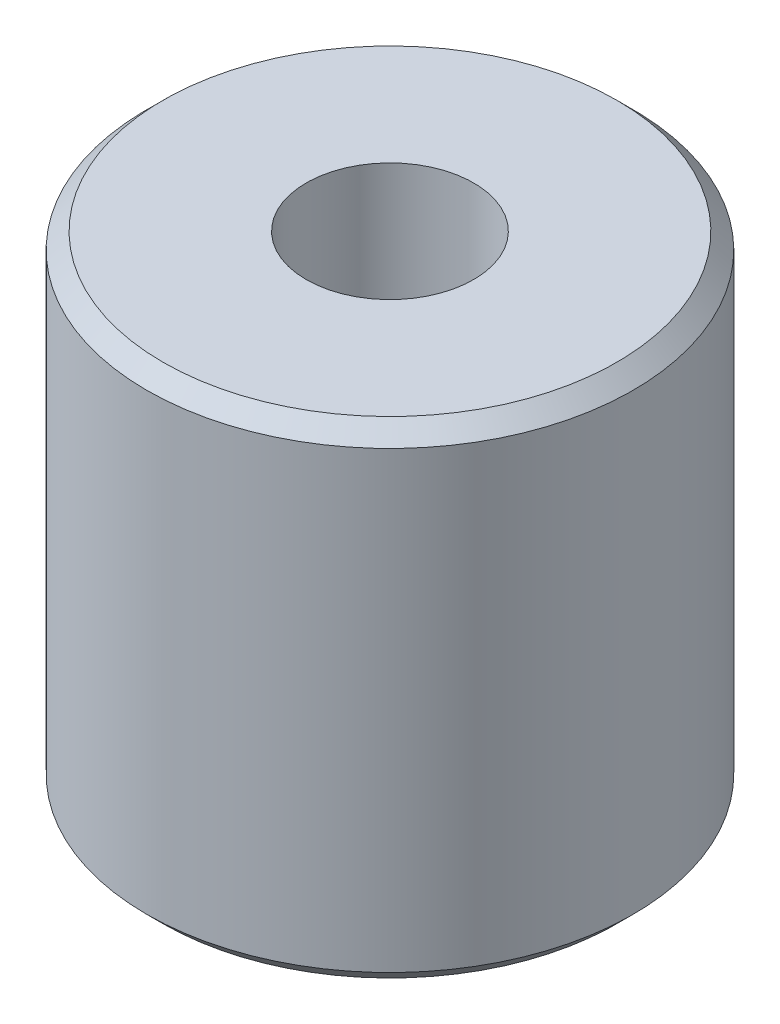
ISO-10303-21;
HEADER;
FILE_DESCRIPTION(('STEP AP214'),'2;1');
FILE_NAME('part.step','',(''),(''),'','','');
FILE_SCHEMA(('AUTOMOTIVE_DESIGN { 1 0 10303 214 1 1 1 1 }'));
ENDSEC;
DATA;
#1=APPLICATION_CONTEXT('core data for automotive mechanical design processes');
#2=APPLICATION_PROTOCOL_DEFINITION('international standard','automotive_design',2000,#1);
#3=PRODUCT_CONTEXT('',#1,'mechanical');
#4=PRODUCT('Part','Part','',(#3));
#5=PRODUCT_RELATED_PRODUCT_CATEGORY('part','',(#4));
#6=PRODUCT_DEFINITION_FORMATION('','',#4);
#7=PRODUCT_DEFINITION_CONTEXT('part definition',#1,'design');
#8=PRODUCT_DEFINITION('design','',#6,#7);
#9=PRODUCT_DEFINITION_SHAPE('','',#8);
#10=(LENGTH_UNIT() NAMED_UNIT(*) SI_UNIT(.MILLI.,.METRE.));
#11=(NAMED_UNIT(*) PLANE_ANGLE_UNIT() SI_UNIT($,.RADIAN.));
#12=(NAMED_UNIT(*) SI_UNIT($,.STERADIAN.) SOLID_ANGLE_UNIT());
#13=UNCERTAINTY_MEASURE_WITH_UNIT(LENGTH_MEASURE(1.E-05),#10,'distance_accuracy_value','');
#14=(GEOMETRIC_REPRESENTATION_CONTEXT(3) GLOBAL_UNCERTAINTY_ASSIGNED_CONTEXT((#13)) GLOBAL_UNIT_ASSIGNED_CONTEXT((#10,
#11,#12)) REPRESENTATION_CONTEXT('',''));
#15=CARTESIAN_POINT('',(0.,0.,0.));
#16=DIRECTION('',(0.,0.,1.));
#17=DIRECTION('',(1.,0.,0.));
#18=AXIS2_PLACEMENT_3D('',#15,#16,#17);
#19=CARTESIAN_POINT('',(0.,9.,0.));
#20=DIRECTION('',(0.,-1.,0.));
#21=DIRECTION('',(0.,0.,-1.));
#22=AXIS2_PLACEMENT_3D('',#19,#20,#21);
#23=CYLINDRICAL_SURFACE('',#22,4.5);
#24=CARTESIAN_POINT('',(0.,0.3,0.));
#25=DIRECTION('',(0.,1.,0.));
#26=DIRECTION('',(0.,0.,1.));
#27=AXIS2_PLACEMENT_3D('',#24,#25,#26);
#28=CIRCLE('',#27,4.5);
#29=CARTESIAN_POINT('',(0.,0.3,4.5));
#30=VERTEX_POINT('',#29);
#31=EDGE_CURVE('E37',#30,#30,#28,.T.);
#32=ORIENTED_EDGE('',*,*,#31,.T.);
#33=EDGE_LOOP('',(#32));
#34=FACE_BOUND('',#33,.T.);
#35=CARTESIAN_POINT('',(0.,8.7,0.));
#36=DIRECTION('',(0.,1.,0.));
#37=DIRECTION('',(0.,0.,1.));
#38=AXIS2_PLACEMENT_3D('',#35,#36,#37);
#39=CIRCLE('',#38,4.5);
#40=CARTESIAN_POINT('',(0.,8.7,4.5));
#41=VERTEX_POINT('',#40);
#42=EDGE_CURVE('E41',#41,#41,#39,.F.);
#43=ORIENTED_EDGE('',*,*,#42,.T.);
#44=EDGE_LOOP('',(#43));
#45=FACE_BOUND('',#44,.T.);
#46=ADVANCED_FACE('F30',(#34,#45),#23,.T.);
#47=CARTESIAN_POINT('',(0.,9.,0.));
#48=DIRECTION('',(0.,1.,0.));
#49=DIRECTION('',(0.,0.,1.));
#50=AXIS2_PLACEMENT_3D('',#47,#48,#49);
#51=PLANE('',#50);
#52=CARTESIAN_POINT('',(0.,9.,0.));
#53=DIRECTION('',(0.,1.,0.));
#54=DIRECTION('',(0.,0.,1.));
#55=AXIS2_PLACEMENT_3D('',#52,#53,#54);
#56=CIRCLE('',#55,1.55);
#57=CARTESIAN_POINT('',(0.,9.,1.55));
#58=VERTEX_POINT('',#57);
#59=EDGE_CURVE('E51',#58,#58,#56,.T.);
#60=ORIENTED_EDGE('',*,*,#59,.F.);
#61=EDGE_LOOP('',(#60));
#62=FACE_BOUND('',#61,.T.);
#63=CARTESIAN_POINT('',(0.,9.,0.));
#64=DIRECTION('',(0.,1.,0.));
#65=DIRECTION('',(0.,0.,1.));
#66=AXIS2_PLACEMENT_3D('',#63,#64,#65);
#67=CIRCLE('',#66,4.2);
#68=CARTESIAN_POINT('',(0.,9.,4.2));
#69=VERTEX_POINT('',#68);
#70=EDGE_CURVE('E45',#69,#69,#67,.T.);
#71=ORIENTED_EDGE('',*,*,#70,.T.);
#72=EDGE_LOOP('',(#71));
#73=FACE_BOUND('',#72,.T.);
#74=ADVANCED_FACE('F65',(#62,#73),#51,.T.);
#75=CARTESIAN_POINT('',(0.,0.,0.));
#76=DIRECTION('',(0.,1.,0.));
#77=DIRECTION('',(0.,0.,1.));
#78=AXIS2_PLACEMENT_3D('',#75,#76,#77);
#79=PLANE('',#78);
#80=CARTESIAN_POINT('',(0.,0.,0.));
#81=DIRECTION('',(0.,1.,0.));
#82=DIRECTION('',(0.,0.,1.));
#83=AXIS2_PLACEMENT_3D('',#80,#81,#82);
#84=CIRCLE('',#83,1.55);
#85=CARTESIAN_POINT('',(0.,0.,1.55));
#86=VERTEX_POINT('',#85);
#87=EDGE_CURVE('E50',#86,#86,#84,.T.);
#88=ORIENTED_EDGE('',*,*,#87,.T.);
#89=EDGE_LOOP('',(#88));
#90=FACE_BOUND('',#89,.T.);
#91=CARTESIAN_POINT('',(0.,0.,0.));
#92=DIRECTION('',(0.,1.,0.));
#93=DIRECTION('',(0.,0.,1.));
#94=AXIS2_PLACEMENT_3D('',#91,#92,#93);
#95=CIRCLE('',#94,4.2);
#96=CARTESIAN_POINT('',(0.,0.,4.2));
#97=VERTEX_POINT('',#96);
#98=EDGE_CURVE('E10',#97,#97,#95,.F.);
#99=ORIENTED_EDGE('',*,*,#98,.T.);
#100=EDGE_LOOP('',(#99));
#101=FACE_BOUND('',#100,.T.);
#102=ADVANCED_FACE('F57',(#90,#101),#79,.F.);
#103=CARTESIAN_POINT('',(0.,9.,0.));
#104=DIRECTION('',(0.,-1.,0.));
#105=DIRECTION('',(0.,0.,-1.));
#106=AXIS2_PLACEMENT_3D('',#103,#104,#105);
#107=CONICAL_SURFACE('',#106,4.2,0.78539816339745);
#108=ORIENTED_EDGE('',*,*,#42,.F.);
#109=EDGE_LOOP('',(#108));
#110=FACE_BOUND('',#109,.T.);
#111=ORIENTED_EDGE('',*,*,#70,.F.);
#112=EDGE_LOOP('',(#111));
#113=FACE_BOUND('',#112,.T.);
#114=ADVANCED_FACE('F71',(#110,#113),#107,.T.);
#115=CARTESIAN_POINT('',(0.,0.3,0.));
#116=DIRECTION('',(0.,1.,0.));
#117=DIRECTION('',(0.,0.,1.));
#118=AXIS2_PLACEMENT_3D('',#115,#116,#117);
#119=CONICAL_SURFACE('',#118,4.5,0.785398163397451);
#120=ORIENTED_EDGE('',*,*,#98,.F.);
#121=EDGE_LOOP('',(#120));
#122=FACE_BOUND('',#121,.T.);
#123=ORIENTED_EDGE('',*,*,#31,.F.);
#124=EDGE_LOOP('',(#123));
#125=FACE_BOUND('',#124,.T.);
#126=ADVANCED_FACE('F32',(#122,#125),#119,.T.);
#127=CARTESIAN_POINT('',(0.,0.,0.));
#128=DIRECTION('',(0.,1.,0.));
#129=DIRECTION('',(0.,0.,1.));
#130=AXIS2_PLACEMENT_3D('',#127,#128,#129);
#131=CYLINDRICAL_SURFACE('',#130,1.55);
#132=ORIENTED_EDGE('',*,*,#87,.F.);
#133=EDGE_LOOP('',(#132));
#134=FACE_BOUND('',#133,.T.);
#135=ORIENTED_EDGE('',*,*,#59,.T.);
#136=EDGE_LOOP('',(#135));
#137=FACE_BOUND('',#136,.T.);
#138=ADVANCED_FACE('F59',(#134,#137),#131,.F.);
#139=CLOSED_SHELL('',(#46,#74,#102,#114,#126,#138));
#140=MANIFOLD_SOLID_BREP('B2',#139);
#141=ADVANCED_BREP_SHAPE_REPRESENTATION('',(#18,#140),#14);
#142=SHAPE_DEFINITION_REPRESENTATION(#9,#141);
ENDSEC;
END-ISO-10303-21;
